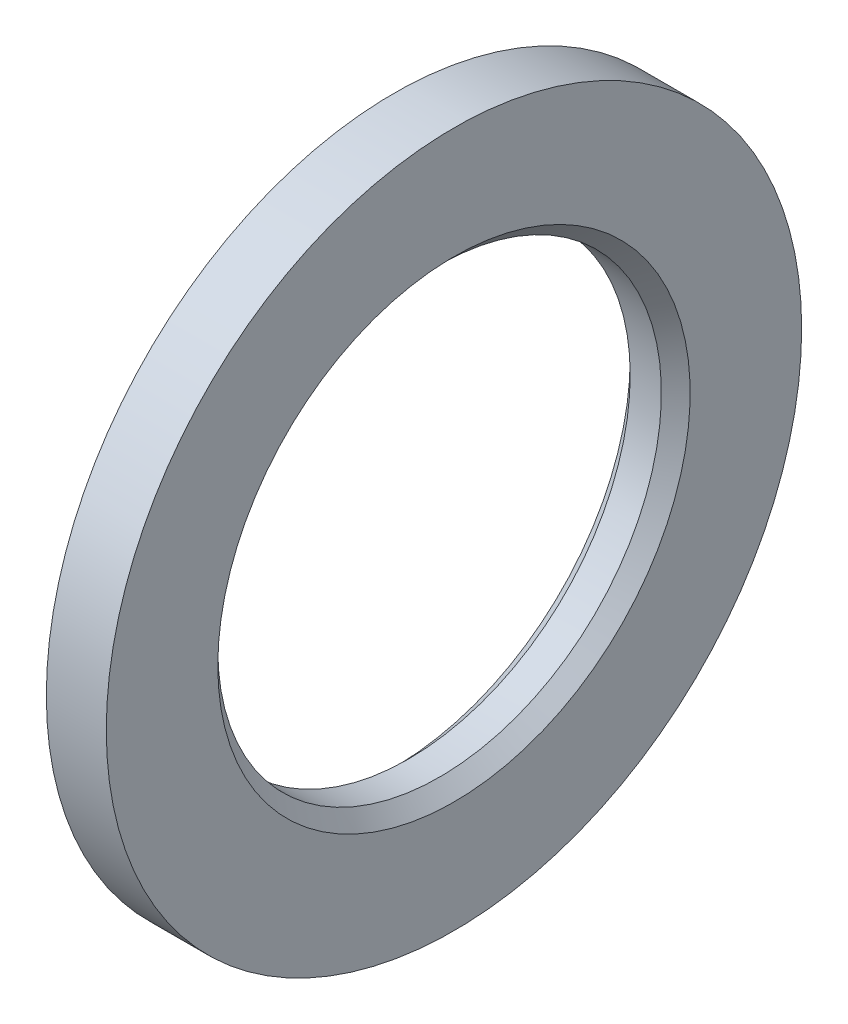
ISO-10303-21;
HEADER;
FILE_DESCRIPTION(('STEP AP214'),'2;1');
FILE_NAME('part.step','',(''),(''),'','','');
FILE_SCHEMA(('AUTOMOTIVE_DESIGN { 1 0 10303 214 1 1 1 1 }'));
ENDSEC;
DATA;
#1=APPLICATION_CONTEXT('core data for automotive mechanical design processes');
#2=APPLICATION_PROTOCOL_DEFINITION('international standard','automotive_design',2000,#1);
#3=PRODUCT_CONTEXT('',#1,'mechanical');
#4=PRODUCT('Part','Part','',(#3));
#5=PRODUCT_RELATED_PRODUCT_CATEGORY('part','',(#4));
#6=PRODUCT_DEFINITION_FORMATION('','',#4);
#7=PRODUCT_DEFINITION_CONTEXT('part definition',#1,'design');
#8=PRODUCT_DEFINITION('design','',#6,#7);
#9=PRODUCT_DEFINITION_SHAPE('','',#8);
#10=(LENGTH_UNIT() NAMED_UNIT(*) SI_UNIT(.MILLI.,.METRE.));
#11=(NAMED_UNIT(*) PLANE_ANGLE_UNIT() SI_UNIT($,.RADIAN.));
#12=(NAMED_UNIT(*) SI_UNIT($,.STERADIAN.) SOLID_ANGLE_UNIT());
#13=UNCERTAINTY_MEASURE_WITH_UNIT(LENGTH_MEASURE(1.E-05),#10,'distance_accuracy_value','');
#14=(GEOMETRIC_REPRESENTATION_CONTEXT(3) GLOBAL_UNCERTAINTY_ASSIGNED_CONTEXT((#13)) GLOBAL_UNIT_ASSIGNED_CONTEXT((#10,
#11,#12)) REPRESENTATION_CONTEXT('',''));
#15=CARTESIAN_POINT('',(0.,0.,0.));
#16=DIRECTION('',(0.,0.,1.));
#17=DIRECTION('',(1.,0.,0.));
#18=AXIS2_PLACEMENT_3D('',#15,#16,#17);
#19=CARTESIAN_POINT('',(-34.9249999999999,0.,0.));
#20=DIRECTION('',(-1.,0.,0.));
#21=DIRECTION('',(0.,0.,1.));
#22=AXIS2_PLACEMENT_3D('',#19,#20,#21);
#23=CYLINDRICAL_SURFACE('',#22,18.5);
#24=CARTESIAN_POINT('',(-3.8,0.,0.));
#25=DIRECTION('',(1.,0.,0.));
#26=DIRECTION('',(0.,0.,-1.));
#27=AXIS2_PLACEMENT_3D('',#24,#25,#26);
#28=CIRCLE('',#27,18.5);
#29=CARTESIAN_POINT('',(-3.8,0.,-18.5));
#30=VERTEX_POINT('',#29);
#31=EDGE_CURVE('E37',#30,#30,#28,.F.);
#32=ORIENTED_EDGE('',*,*,#31,.T.);
#33=EDGE_LOOP('',(#32));
#34=FACE_BOUND('',#33,.T.);
#35=CARTESIAN_POINT('',(-1.2,0.,0.));
#36=DIRECTION('',(-1.,0.,0.));
#37=DIRECTION('',(0.,0.,1.));
#38=AXIS2_PLACEMENT_3D('',#35,#36,#37);
#39=CIRCLE('',#38,18.5);
#40=CARTESIAN_POINT('',(-1.2,0.,18.5));
#41=VERTEX_POINT('',#40);
#42=EDGE_CURVE('E41',#41,#41,#39,.F.);
#43=ORIENTED_EDGE('',*,*,#42,.T.);
#44=EDGE_LOOP('',(#43));
#45=FACE_BOUND('',#44,.T.);
#46=ADVANCED_FACE('F30',(#34,#45),#23,.F.);
#47=CARTESIAN_POINT('',(0.,18.5,0.));
#48=DIRECTION('',(-1.,0.,0.));
#49=DIRECTION('',(0.,0.,1.));
#50=AXIS2_PLACEMENT_3D('',#47,#48,#49);
#51=PLANE('',#50);
#52=CARTESIAN_POINT('',(0.,0.,0.));
#53=DIRECTION('',(-1.,0.,0.));
#54=DIRECTION('',(0.,0.,1.));
#55=AXIS2_PLACEMENT_3D('',#52,#53,#54);
#56=CIRCLE('',#55,19.7);
#57=CARTESIAN_POINT('',(0.,0.,19.7));
#58=VERTEX_POINT('',#57);
#59=EDGE_CURVE('E45',#58,#58,#56,.T.);
#60=ORIENTED_EDGE('',*,*,#59,.T.);
#61=EDGE_LOOP('',(#60));
#62=FACE_BOUND('',#61,.T.);
#63=CARTESIAN_POINT('',(0.,0.,0.));
#64=DIRECTION('',(-1.,0.,0.));
#65=DIRECTION('',(0.,0.,1.));
#66=AXIS2_PLACEMENT_3D('',#63,#64,#65);
#67=CIRCLE('',#66,29.);
#68=CARTESIAN_POINT('',(0.,0.,29.));
#69=VERTEX_POINT('',#68);
#70=EDGE_CURVE('E50',#69,#69,#67,.T.);
#71=ORIENTED_EDGE('',*,*,#70,.F.);
#72=EDGE_LOOP('',(#71));
#73=FACE_BOUND('',#72,.T.);
#74=ADVANCED_FACE('F62',(#62,#73),#51,.F.);
#75=CARTESIAN_POINT('',(-34.9249999999999,0.,0.));
#76=DIRECTION('',(-1.,0.,0.));
#77=DIRECTION('',(0.,0.,1.));
#78=AXIS2_PLACEMENT_3D('',#75,#76,#77);
#79=CYLINDRICAL_SURFACE('',#78,29.);
#80=CARTESIAN_POINT('',(-5.,0.,0.));
#81=DIRECTION('',(-1.,0.,0.));
#82=DIRECTION('',(0.,0.,1.));
#83=AXIS2_PLACEMENT_3D('',#80,#81,#82);
#84=CIRCLE('',#83,29.);
#85=CARTESIAN_POINT('',(-5.,0.,29.));
#86=VERTEX_POINT('',#85);
#87=EDGE_CURVE('E53',#86,#86,#84,.T.);
#88=ORIENTED_EDGE('',*,*,#87,.F.);
#89=EDGE_LOOP('',(#88));
#90=FACE_BOUND('',#89,.T.);
#91=ORIENTED_EDGE('',*,*,#70,.T.);
#92=EDGE_LOOP('',(#91));
#93=FACE_BOUND('',#92,.T.);
#94=ADVANCED_FACE('F59',(#90,#93),#79,.T.);
#95=CARTESIAN_POINT('',(-5.,29.,0.));
#96=DIRECTION('',(1.,0.,0.));
#97=DIRECTION('',(0.,0.,-1.));
#98=AXIS2_PLACEMENT_3D('',#95,#96,#97);
#99=PLANE('',#98);
#100=CARTESIAN_POINT('',(-5.,0.,0.));
#101=DIRECTION('',(1.,0.,0.));
#102=DIRECTION('',(0.,0.,-1.));
#103=AXIS2_PLACEMENT_3D('',#100,#101,#102);
#104=CIRCLE('',#103,19.7);
#105=CARTESIAN_POINT('',(-5.,0.,-19.7));
#106=VERTEX_POINT('',#105);
#107=EDGE_CURVE('E10',#106,#106,#104,.T.);
#108=ORIENTED_EDGE('',*,*,#107,.T.);
#109=EDGE_LOOP('',(#108));
#110=FACE_BOUND('',#109,.T.);
#111=ORIENTED_EDGE('',*,*,#87,.T.);
#112=EDGE_LOOP('',(#111));
#113=FACE_BOUND('',#112,.T.);
#114=ADVANCED_FACE('F57',(#110,#113),#99,.F.);
#115=CARTESIAN_POINT('',(0.,0.,0.));
#116=DIRECTION('',(1.,0.,0.));
#117=DIRECTION('',(0.,0.,-1.));
#118=AXIS2_PLACEMENT_3D('',#115,#116,#117);
#119=CONICAL_SURFACE('',#118,19.7,0.78539816339745);
#120=ORIENTED_EDGE('',*,*,#42,.F.);
#121=EDGE_LOOP('',(#120));
#122=FACE_BOUND('',#121,.T.);
#123=ORIENTED_EDGE('',*,*,#59,.F.);
#124=EDGE_LOOP('',(#123));
#125=FACE_BOUND('',#124,.T.);
#126=ADVANCED_FACE('F74',(#122,#125),#119,.F.);
#127=CARTESIAN_POINT('',(-3.8,0.,0.));
#128=DIRECTION('',(-1.,0.,0.));
#129=DIRECTION('',(0.,0.,1.));
#130=AXIS2_PLACEMENT_3D('',#127,#128,#129);
#131=CONICAL_SURFACE('',#130,18.5,0.785398163397451);
#132=ORIENTED_EDGE('',*,*,#107,.F.);
#133=EDGE_LOOP('',(#132));
#134=FACE_BOUND('',#133,.T.);
#135=ORIENTED_EDGE('',*,*,#31,.F.);
#136=EDGE_LOOP('',(#135));
#137=FACE_BOUND('',#136,.T.);
#138=ADVANCED_FACE('F32',(#134,#137),#131,.F.);
#139=CLOSED_SHELL('',(#46,#74,#94,#114,#126,#138));
#140=MANIFOLD_SOLID_BREP('B2',#139);
#141=ADVANCED_BREP_SHAPE_REPRESENTATION('',(#18,#140),#14);
#142=SHAPE_DEFINITION_REPRESENTATION(#9,#141);
ENDSEC;
END-ISO-10303-21;
